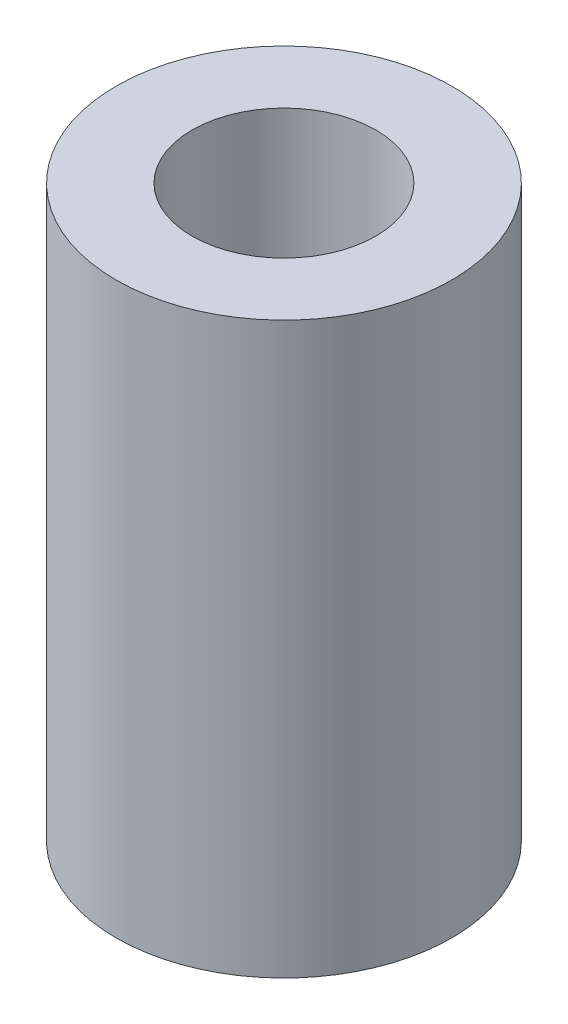
ISO-10303-21;
HEADER;
FILE_DESCRIPTION(('STEP AP214'),'2;1');
FILE_NAME('part.step','',(''),(''),'','','');
FILE_SCHEMA(('AUTOMOTIVE_DESIGN { 1 0 10303 214 1 1 1 1 }'));
ENDSEC;
DATA;
#1=APPLICATION_CONTEXT('core data for automotive mechanical design processes');
#2=APPLICATION_PROTOCOL_DEFINITION('international standard','automotive_design',2000,#1);
#3=PRODUCT_CONTEXT('',#1,'mechanical');
#4=PRODUCT('Part','Part','',(#3));
#5=PRODUCT_RELATED_PRODUCT_CATEGORY('part','',(#4));
#6=PRODUCT_DEFINITION_FORMATION('','',#4);
#7=PRODUCT_DEFINITION_CONTEXT('part definition',#1,'design');
#8=PRODUCT_DEFINITION('design','',#6,#7);
#9=PRODUCT_DEFINITION_SHAPE('','',#8);
#10=(LENGTH_UNIT() NAMED_UNIT(*) SI_UNIT(.MILLI.,.METRE.));
#11=(NAMED_UNIT(*) PLANE_ANGLE_UNIT() SI_UNIT($,.RADIAN.));
#12=(NAMED_UNIT(*) SI_UNIT($,.STERADIAN.) SOLID_ANGLE_UNIT());
#13=UNCERTAINTY_MEASURE_WITH_UNIT(LENGTH_MEASURE(1.E-05),#10,'distance_accuracy_value','');
#14=(GEOMETRIC_REPRESENTATION_CONTEXT(3) GLOBAL_UNCERTAINTY_ASSIGNED_CONTEXT((#13)) GLOBAL_UNIT_ASSIGNED_CONTEXT((#10,
#11,#12)) REPRESENTATION_CONTEXT('',''));
#15=CARTESIAN_POINT('',(0.,0.,0.));
#16=DIRECTION('',(0.,0.,1.));
#17=DIRECTION('',(1.,0.,0.));
#18=AXIS2_PLACEMENT_3D('',#15,#16,#17);
#19=CARTESIAN_POINT('',(0.,75.,0.));
#20=DIRECTION('',(0.,1.,0.));
#21=DIRECTION('',(0.,0.,1.));
#22=AXIS2_PLACEMENT_3D('',#19,#20,#21);
#23=PLANE('',#22);
#24=CARTESIAN_POINT('',(0.,75.,0.));
#25=DIRECTION('',(0.,1.,0.));
#26=DIRECTION('',(0.,0.,1.));
#27=AXIS2_PLACEMENT_3D('',#24,#25,#26);
#28=CIRCLE('',#27,44.2);
#29=CARTESIAN_POINT('',(0.,75.,44.2));
#30=VERTEX_POINT('',#29);
#31=EDGE_CURVE('E10',#30,#30,#28,.T.);
#32=ORIENTED_EDGE('',*,*,#31,.T.);
#33=EDGE_LOOP('',(#32));
#34=FACE_BOUND('',#33,.T.);
#35=CARTESIAN_POINT('',(0.,75.,0.));
#36=DIRECTION('',(0.,1.,0.));
#37=DIRECTION('',(0.,0.,1.));
#38=AXIS2_PLACEMENT_3D('',#35,#36,#37);
#39=CIRCLE('',#38,24.2);
#40=CARTESIAN_POINT('',(0.,75.,24.2));
#41=VERTEX_POINT('',#40);
#42=EDGE_CURVE('E39',#41,#41,#39,.T.);
#43=ORIENTED_EDGE('',*,*,#42,.F.);
#44=EDGE_LOOP('',(#43));
#45=FACE_BOUND('',#44,.T.);
#46=ADVANCED_FACE('F28',(#34,#45),#23,.T.);
#47=CARTESIAN_POINT('',(0.,-75.,0.));
#48=DIRECTION('',(0.,1.,0.));
#49=DIRECTION('',(0.,0.,1.));
#50=AXIS2_PLACEMENT_3D('',#47,#48,#49);
#51=PLANE('',#50);
#52=CARTESIAN_POINT('',(0.,-75.,0.));
#53=DIRECTION('',(0.,1.,0.));
#54=DIRECTION('',(0.,0.,1.));
#55=AXIS2_PLACEMENT_3D('',#52,#53,#54);
#56=CIRCLE('',#55,44.2);
#57=CARTESIAN_POINT('',(0.,-75.,44.2));
#58=VERTEX_POINT('',#57);
#59=EDGE_CURVE('E32',#58,#58,#56,.T.);
#60=ORIENTED_EDGE('',*,*,#59,.F.);
#61=EDGE_LOOP('',(#60));
#62=FACE_BOUND('',#61,.T.);
#63=CARTESIAN_POINT('',(0.,-75.,0.));
#64=DIRECTION('',(0.,1.,0.));
#65=DIRECTION('',(0.,0.,1.));
#66=AXIS2_PLACEMENT_3D('',#63,#64,#65);
#67=CIRCLE('',#66,24.2);
#68=CARTESIAN_POINT('',(0.,-75.,24.2));
#69=VERTEX_POINT('',#68);
#70=EDGE_CURVE('E41',#69,#69,#67,.T.);
#71=ORIENTED_EDGE('',*,*,#70,.T.);
#72=EDGE_LOOP('',(#71));
#73=FACE_BOUND('',#72,.T.);
#74=ADVANCED_FACE('F51',(#62,#73),#51,.F.);
#75=CARTESIAN_POINT('',(0.,75.,0.));
#76=DIRECTION('',(0.,-1.,0.));
#77=DIRECTION('',(0.,0.,-1.));
#78=AXIS2_PLACEMENT_3D('',#75,#76,#77);
#79=CYLINDRICAL_SURFACE('',#78,44.2);
#80=ORIENTED_EDGE('',*,*,#31,.F.);
#81=EDGE_LOOP('',(#80));
#82=FACE_BOUND('',#81,.T.);
#83=ORIENTED_EDGE('',*,*,#59,.T.);
#84=EDGE_LOOP('',(#83));
#85=FACE_BOUND('',#84,.T.);
#86=ADVANCED_FACE('F30',(#82,#85),#79,.T.);
#87=CARTESIAN_POINT('',(0.,75.,0.));
#88=DIRECTION('',(0.,-1.,0.));
#89=DIRECTION('',(0.,0.,-1.));
#90=AXIS2_PLACEMENT_3D('',#87,#88,#89);
#91=CYLINDRICAL_SURFACE('',#90,24.2);
#92=ORIENTED_EDGE('',*,*,#42,.T.);
#93=EDGE_LOOP('',(#92));
#94=FACE_BOUND('',#93,.T.);
#95=ORIENTED_EDGE('',*,*,#70,.F.);
#96=EDGE_LOOP('',(#95));
#97=FACE_BOUND('',#96,.T.);
#98=ADVANCED_FACE('F47',(#94,#97),#91,.F.);
#99=CLOSED_SHELL('',(#46,#74,#86,#98));
#100=MANIFOLD_SOLID_BREP('B2',#99);
#101=ADVANCED_BREP_SHAPE_REPRESENTATION('',(#18,#100),#14);
#102=SHAPE_DEFINITION_REPRESENTATION(#9,#101);
ENDSEC;
END-ISO-10303-21;
